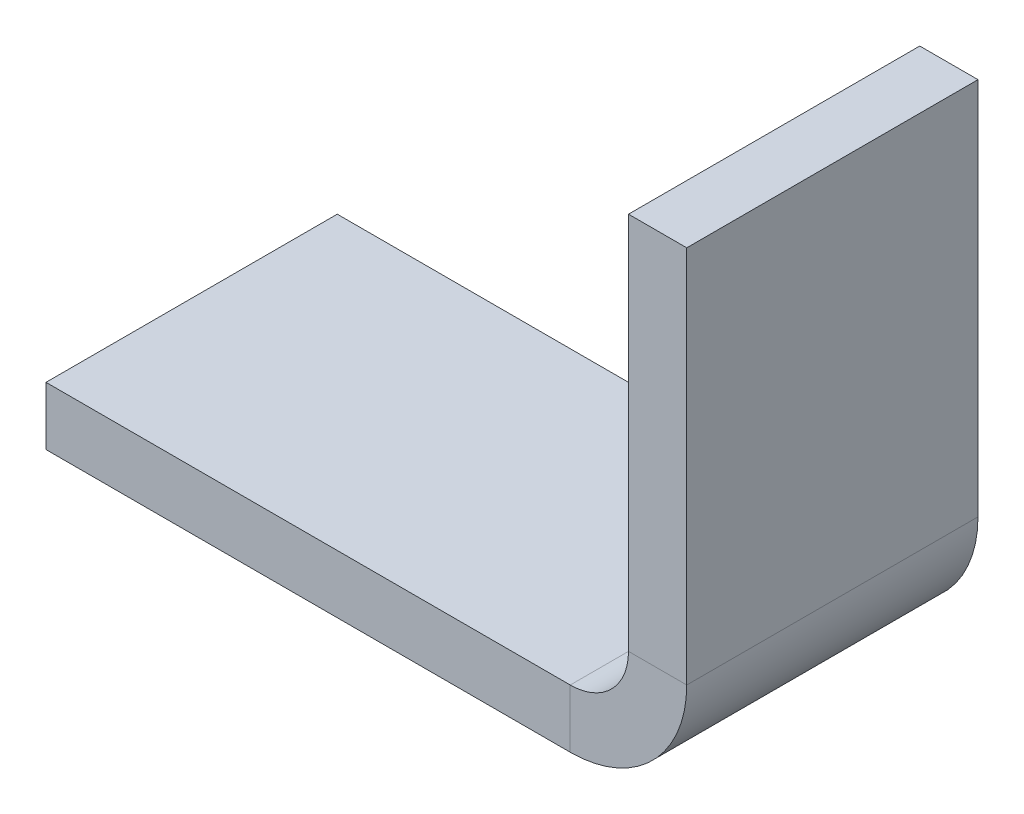
ISO-10303-21;
HEADER;
FILE_DESCRIPTION(('STEP AP214'),'2;1');
FILE_NAME('part.step','',(''),(''),'','','');
FILE_SCHEMA(('AUTOMOTIVE_DESIGN { 1 0 10303 214 1 1 1 1 }'));
ENDSEC;
DATA;
#1=APPLICATION_CONTEXT('core data for automotive mechanical design processes');
#2=APPLICATION_PROTOCOL_DEFINITION('international standard','automotive_design',2000,#1);
#3=PRODUCT_CONTEXT('',#1,'mechanical');
#4=PRODUCT('Part','Part','',(#3));
#5=PRODUCT_RELATED_PRODUCT_CATEGORY('part','',(#4));
#6=PRODUCT_DEFINITION_FORMATION('','',#4);
#7=PRODUCT_DEFINITION_CONTEXT('part definition',#1,'design');
#8=PRODUCT_DEFINITION('design','',#6,#7);
#9=PRODUCT_DEFINITION_SHAPE('','',#8);
#10=(LENGTH_UNIT() NAMED_UNIT(*) SI_UNIT(.MILLI.,.METRE.));
#11=(NAMED_UNIT(*) PLANE_ANGLE_UNIT() SI_UNIT($,.RADIAN.));
#12=(NAMED_UNIT(*) SI_UNIT($,.STERADIAN.) SOLID_ANGLE_UNIT());
#13=UNCERTAINTY_MEASURE_WITH_UNIT(LENGTH_MEASURE(1.E-05),#10,'distance_accuracy_value','');
#14=(GEOMETRIC_REPRESENTATION_CONTEXT(3) GLOBAL_UNCERTAINTY_ASSIGNED_CONTEXT((#13)) GLOBAL_UNIT_ASSIGNED_CONTEXT((#10,
#11,#12)) REPRESENTATION_CONTEXT('',''));
#15=CARTESIAN_POINT('',(0.,0.,0.));
#16=DIRECTION('',(0.,0.,1.));
#17=DIRECTION('',(1.,0.,0.));
#18=AXIS2_PLACEMENT_3D('',#15,#16,#17);
#19=CARTESIAN_POINT('',(20.,2.,10.));
#20=DIRECTION('',(0.,0.,1.));
#21=DIRECTION('',(1.,0.,0.));
#22=AXIS2_PLACEMENT_3D('',#19,#20,#21);
#23=PLANE('',#22);
#24=DIRECTION('',(1.,0.,0.));
#25=VECTOR('',#24,1.);
#26=CARTESIAN_POINT('',(20.,2.,10.));
#27=LINE('',#26,#25);
#28=CARTESIAN_POINT('',(20.,2.,10.));
#29=VERTEX_POINT('',#28);
#30=CARTESIAN_POINT('',(22.,2.,10.));
#31=VERTEX_POINT('',#30);
#32=EDGE_CURVE('E11',#29,#31,#27,.T.);
#33=ORIENTED_EDGE('',*,*,#32,.F.);
#34=CARTESIAN_POINT('',(18.,2.,10.));
#35=DIRECTION('',(0.,0.,-1.));
#36=DIRECTION('',(-1.,0.,0.));
#37=AXIS2_PLACEMENT_3D('',#34,#35,#36);
#38=CIRCLE('',#37,2.);
#39=CARTESIAN_POINT('',(18.,0.,10.));
#40=VERTEX_POINT('',#39);
#41=EDGE_CURVE('E139',#40,#29,#38,.F.);
#42=ORIENTED_EDGE('',*,*,#41,.F.);
#43=DIRECTION('',(0.,1.,0.));
#44=VECTOR('',#43,1.);
#45=CARTESIAN_POINT('',(18.,-2.,10.));
#46=LINE('',#45,#44);
#47=CARTESIAN_POINT('',(18.,-2.,10.));
#48=VERTEX_POINT('',#47);
#49=EDGE_CURVE('E47',#48,#40,#46,.T.);
#50=ORIENTED_EDGE('',*,*,#49,.F.);
#51=CARTESIAN_POINT('',(18.,2.,10.));
#52=DIRECTION('',(0.,0.,1.));
#53=DIRECTION('',(1.,0.,0.));
#54=AXIS2_PLACEMENT_3D('',#51,#52,#53);
#55=CIRCLE('',#54,4.);
#56=EDGE_CURVE('E133',#48,#31,#55,.T.);
#57=ORIENTED_EDGE('',*,*,#56,.T.);
#58=EDGE_LOOP('',(#33,#42,#50,#57));
#59=FACE_BOUND('',#58,.T.);
#60=ADVANCED_FACE('F41',(#59),#23,.T.);
#61=CARTESIAN_POINT('',(18.,-2.,10.));
#62=DIRECTION('',(0.,0.,1.));
#63=DIRECTION('',(1.,0.,0.));
#64=AXIS2_PLACEMENT_3D('',#61,#62,#63);
#65=PLANE('',#64);
#66=DIRECTION('',(0.,1.,0.));
#67=VECTOR('',#66,1.);
#68=CARTESIAN_POINT('',(20.,0.,10.));
#69=LINE('',#68,#67);
#70=CARTESIAN_POINT('',(20.,15.,10.));
#71=VERTEX_POINT('',#70);
#72=EDGE_CURVE('E189',#29,#71,#69,.T.);
#73=ORIENTED_EDGE('',*,*,#72,.F.);
#74=ORIENTED_EDGE('',*,*,#32,.T.);
#75=DIRECTION('',(0.,1.,0.));
#76=VECTOR('',#75,1.);
#77=CARTESIAN_POINT('',(22.,0.,10.));
#78=LINE('',#77,#76);
#79=CARTESIAN_POINT('',(22.,15.,10.));
#80=VERTEX_POINT('',#79);
#81=EDGE_CURVE('E100',#31,#80,#78,.T.);
#82=ORIENTED_EDGE('',*,*,#81,.T.);
#83=DIRECTION('',(1.,0.,0.));
#84=VECTOR('',#83,1.);
#85=CARTESIAN_POINT('',(20.,15.,10.));
#86=LINE('',#85,#84);
#87=EDGE_CURVE('E341',#71,#80,#86,.T.);
#88=ORIENTED_EDGE('',*,*,#87,.F.);
#89=EDGE_LOOP('',(#73,#74,#82,#88));
#90=FACE_BOUND('',#89,.T.);
#91=ADVANCED_FACE('F193',(#90),#65,.T.);
#92=CARTESIAN_POINT('',(18.,0.,0.));
#93=DIRECTION('',(0.,0.,-1.));
#94=DIRECTION('',(-1.,0.,0.));
#95=AXIS2_PLACEMENT_3D('',#92,#93,#94);
#96=PLANE('',#95);
#97=DIRECTION('',(0.,-1.,0.));
#98=VECTOR('',#97,1.);
#99=CARTESIAN_POINT('',(18.,0.,0.));
#100=LINE('',#99,#98);
#101=CARTESIAN_POINT('',(18.,0.,0.));
#102=VERTEX_POINT('',#101);
#103=CARTESIAN_POINT('',(18.,-2.,0.));
#104=VERTEX_POINT('',#103);
#105=EDGE_CURVE('E81',#102,#104,#100,.T.);
#106=ORIENTED_EDGE('',*,*,#105,.F.);
#107=CARTESIAN_POINT('',(18.,2.,0.));
#108=DIRECTION('',(0.,0.,-1.));
#109=DIRECTION('',(-1.,0.,0.));
#110=AXIS2_PLACEMENT_3D('',#107,#108,#109);
#111=CIRCLE('',#110,2.);
#112=CARTESIAN_POINT('',(20.,2.,0.));
#113=VERTEX_POINT('',#112);
#114=EDGE_CURVE('E153',#102,#113,#111,.F.);
#115=ORIENTED_EDGE('',*,*,#114,.T.);
#116=DIRECTION('',(-1.,0.,0.));
#117=VECTOR('',#116,1.);
#118=CARTESIAN_POINT('',(22.,2.,0.));
#119=LINE('',#118,#117);
#120=CARTESIAN_POINT('',(22.,2.,0.));
#121=VERTEX_POINT('',#120);
#122=EDGE_CURVE('E93',#121,#113,#119,.T.);
#123=ORIENTED_EDGE('',*,*,#122,.F.);
#124=CARTESIAN_POINT('',(18.,2.,0.));
#125=DIRECTION('',(0.,0.,1.));
#126=DIRECTION('',(1.,0.,0.));
#127=AXIS2_PLACEMENT_3D('',#124,#125,#126);
#128=CIRCLE('',#127,4.);
#129=EDGE_CURVE('E159',#104,#121,#128,.T.);
#130=ORIENTED_EDGE('',*,*,#129,.F.);
#131=EDGE_LOOP('',(#106,#115,#123,#130));
#132=FACE_BOUND('',#131,.T.);
#133=ADVANCED_FACE('F194',(#132),#96,.T.);
#134=CARTESIAN_POINT('',(22.,2.,0.));
#135=DIRECTION('',(0.,0.,-1.));
#136=DIRECTION('',(-1.,0.,0.));
#137=AXIS2_PLACEMENT_3D('',#134,#135,#136);
#138=PLANE('',#137);
#139=DIRECTION('',(1.,0.,0.));
#140=VECTOR('',#139,1.);
#141=CARTESIAN_POINT('',(0.,0.,0.));
#142=LINE('',#141,#140);
#143=CARTESIAN_POINT('',(0.,0.,0.));
#144=VERTEX_POINT('',#143);
#145=EDGE_CURVE('E154',#144,#102,#142,.T.);
#146=ORIENTED_EDGE('',*,*,#145,.T.);
#147=ORIENTED_EDGE('',*,*,#105,.T.);
#148=DIRECTION('',(1.,0.,0.));
#149=VECTOR('',#148,1.);
#150=CARTESIAN_POINT('',(0.,-2.,0.));
#151=LINE('',#150,#149);
#152=CARTESIAN_POINT('',(0.,-2.,0.));
#153=VERTEX_POINT('',#152);
#154=EDGE_CURVE('E158',#153,#104,#151,.T.);
#155=ORIENTED_EDGE('',*,*,#154,.F.);
#156=DIRECTION('',(0.,1.,0.));
#157=VECTOR('',#156,1.);
#158=CARTESIAN_POINT('',(0.,-2.,0.));
#159=LINE('',#158,#157);
#160=EDGE_CURVE('E120',#153,#144,#159,.T.);
#161=ORIENTED_EDGE('',*,*,#160,.T.);
#162=EDGE_LOOP('',(#146,#147,#155,#161));
#163=FACE_BOUND('',#162,.T.);
#164=ADVANCED_FACE('F190',(#163),#138,.T.);
#165=CARTESIAN_POINT('',(22.,0.,10.));
#166=DIRECTION('',(-1.,0.,0.));
#167=DIRECTION('',(0.,0.,1.));
#168=AXIS2_PLACEMENT_3D('',#165,#166,#167);
#169=PLANE('',#168);
#170=DIRECTION('',(0.,1.,0.));
#171=VECTOR('',#170,1.);
#172=CARTESIAN_POINT('',(22.,0.,0.));
#173=LINE('',#172,#171);
#174=CARTESIAN_POINT('',(22.,15.,0.));
#175=VERTEX_POINT('',#174);
#176=EDGE_CURVE('E145',#121,#175,#173,.T.);
#177=ORIENTED_EDGE('',*,*,#176,.T.);
#178=DIRECTION('',(0.,0.,-1.));
#179=VECTOR('',#178,1.);
#180=CARTESIAN_POINT('',(22.,15.,10.));
#181=LINE('',#180,#179);
#182=EDGE_CURVE('E175',#80,#175,#181,.T.);
#183=ORIENTED_EDGE('',*,*,#182,.F.);
#184=ORIENTED_EDGE('',*,*,#81,.F.);
#185=DIRECTION('',(0.,0.,-1.));
#186=VECTOR('',#185,1.);
#187=CARTESIAN_POINT('',(22.,2.,10.));
#188=LINE('',#187,#186);
#189=EDGE_CURVE('E141',#31,#121,#188,.T.);
#190=ORIENTED_EDGE('',*,*,#189,.T.);
#191=EDGE_LOOP('',(#177,#183,#184,#190));
#192=FACE_BOUND('',#191,.T.);
#193=ADVANCED_FACE('F203',(#192),#169,.F.);
#194=CARTESIAN_POINT('',(20.,15.,10.));
#195=DIRECTION('',(0.,1.,0.));
#196=DIRECTION('',(0.,0.,1.));
#197=AXIS2_PLACEMENT_3D('',#194,#195,#196);
#198=PLANE('',#197);
#199=DIRECTION('',(1.,0.,0.));
#200=VECTOR('',#199,1.);
#201=CARTESIAN_POINT('',(20.,15.,0.));
#202=LINE('',#201,#200);
#203=CARTESIAN_POINT('',(20.,15.,0.));
#204=VERTEX_POINT('',#203);
#205=EDGE_CURVE('E150',#204,#175,#202,.T.);
#206=ORIENTED_EDGE('',*,*,#205,.F.);
#207=DIRECTION('',(0.,0.,-1.));
#208=VECTOR('',#207,1.);
#209=CARTESIAN_POINT('',(20.,15.,10.));
#210=LINE('',#209,#208);
#211=EDGE_CURVE('E174',#71,#204,#210,.T.);
#212=ORIENTED_EDGE('',*,*,#211,.F.);
#213=ORIENTED_EDGE('',*,*,#87,.T.);
#214=ORIENTED_EDGE('',*,*,#182,.T.);
#215=EDGE_LOOP('',(#206,#212,#213,#214));
#216=FACE_BOUND('',#215,.T.);
#217=ADVANCED_FACE('F231',(#216),#198,.T.);
#218=CARTESIAN_POINT('',(20.,0.,10.));
#219=DIRECTION('',(-1.,0.,0.));
#220=DIRECTION('',(0.,0.,1.));
#221=AXIS2_PLACEMENT_3D('',#218,#219,#220);
#222=PLANE('',#221);
#223=DIRECTION('',(0.,1.,0.));
#224=VECTOR('',#223,1.);
#225=CARTESIAN_POINT('',(20.,0.,0.));
#226=LINE('',#225,#224);
#227=EDGE_CURVE('E147',#113,#204,#226,.T.);
#228=ORIENTED_EDGE('',*,*,#227,.F.);
#229=DIRECTION('',(0.,0.,-1.));
#230=VECTOR('',#229,1.);
#231=CARTESIAN_POINT('',(20.,2.,10.));
#232=LINE('',#231,#230);
#233=EDGE_CURVE('E166',#29,#113,#232,.T.);
#234=ORIENTED_EDGE('',*,*,#233,.F.);
#235=ORIENTED_EDGE('',*,*,#72,.T.);
#236=ORIENTED_EDGE('',*,*,#211,.T.);
#237=EDGE_LOOP('',(#228,#234,#235,#236));
#238=FACE_BOUND('',#237,.T.);
#239=ADVANCED_FACE('F241',(#238),#222,.T.);
#240=CARTESIAN_POINT('',(18.,2.,10.));
#241=DIRECTION('',(0.,0.,-1.));
#242=DIRECTION('',(-1.,0.,0.));
#243=AXIS2_PLACEMENT_3D('',#240,#241,#242);
#244=CYLINDRICAL_SURFACE('',#243,2.);
#245=ORIENTED_EDGE('',*,*,#114,.F.);
#246=DIRECTION('',(0.,0.,-1.));
#247=VECTOR('',#246,1.);
#248=CARTESIAN_POINT('',(18.,0.,10.));
#249=LINE('',#248,#247);
#250=EDGE_CURVE('E167',#40,#102,#249,.T.);
#251=ORIENTED_EDGE('',*,*,#250,.F.);
#252=ORIENTED_EDGE('',*,*,#41,.T.);
#253=ORIENTED_EDGE('',*,*,#233,.T.);
#254=EDGE_LOOP('',(#245,#251,#252,#253));
#255=FACE_BOUND('',#254,.T.);
#256=ADVANCED_FACE('F181',(#255),#244,.F.);
#257=CARTESIAN_POINT('',(0.,0.,10.));
#258=DIRECTION('',(0.,1.,0.));
#259=DIRECTION('',(0.,0.,1.));
#260=AXIS2_PLACEMENT_3D('',#257,#258,#259);
#261=PLANE('',#260);
#262=ORIENTED_EDGE('',*,*,#145,.F.);
#263=DIRECTION('',(0.,0.,-1.));
#264=VECTOR('',#263,1.);
#265=CARTESIAN_POINT('',(0.,0.,10.));
#266=LINE('',#265,#264);
#267=CARTESIAN_POINT('',(0.,0.,10.));
#268=VERTEX_POINT('',#267);
#269=EDGE_CURVE('E122',#268,#144,#266,.T.);
#270=ORIENTED_EDGE('',*,*,#269,.F.);
#271=DIRECTION('',(1.,0.,0.));
#272=VECTOR('',#271,1.);
#273=CARTESIAN_POINT('',(0.,0.,10.));
#274=LINE('',#273,#272);
#275=EDGE_CURVE('E137',#268,#40,#274,.T.);
#276=ORIENTED_EDGE('',*,*,#275,.T.);
#277=ORIENTED_EDGE('',*,*,#250,.T.);
#278=EDGE_LOOP('',(#262,#270,#276,#277));
#279=FACE_BOUND('',#278,.T.);
#280=ADVANCED_FACE('F187',(#279),#261,.T.);
#281=CARTESIAN_POINT('',(0.,-2.,10.));
#282=DIRECTION('',(-1.,0.,0.));
#283=DIRECTION('',(0.,0.,1.));
#284=AXIS2_PLACEMENT_3D('',#281,#282,#283);
#285=PLANE('',#284);
#286=ORIENTED_EDGE('',*,*,#160,.F.);
#287=DIRECTION('',(0.,0.,-1.));
#288=VECTOR('',#287,1.);
#289=CARTESIAN_POINT('',(0.,-2.,10.));
#290=LINE('',#289,#288);
#291=CARTESIAN_POINT('',(0.,-2.,10.));
#292=VERTEX_POINT('',#291);
#293=EDGE_CURVE('E114',#292,#153,#290,.T.);
#294=ORIENTED_EDGE('',*,*,#293,.F.);
#295=DIRECTION('',(0.,1.,0.));
#296=VECTOR('',#295,1.);
#297=CARTESIAN_POINT('',(0.,-2.,10.));
#298=LINE('',#297,#296);
#299=EDGE_CURVE('E119',#292,#268,#298,.T.);
#300=ORIENTED_EDGE('',*,*,#299,.T.);
#301=ORIENTED_EDGE('',*,*,#269,.T.);
#302=EDGE_LOOP('',(#286,#294,#300,#301));
#303=FACE_BOUND('',#302,.T.);
#304=ADVANCED_FACE('F113',(#303),#285,.T.);
#305=CARTESIAN_POINT('',(0.,-2.,10.));
#306=DIRECTION('',(0.,1.,0.));
#307=DIRECTION('',(0.,0.,1.));
#308=AXIS2_PLACEMENT_3D('',#305,#306,#307);
#309=PLANE('',#308);
#310=ORIENTED_EDGE('',*,*,#154,.T.);
#311=DIRECTION('',(0.,0.,-1.));
#312=VECTOR('',#311,1.);
#313=CARTESIAN_POINT('',(18.,-2.,10.));
#314=LINE('',#313,#312);
#315=EDGE_CURVE('E125',#48,#104,#314,.T.);
#316=ORIENTED_EDGE('',*,*,#315,.F.);
#317=DIRECTION('',(1.,0.,0.));
#318=VECTOR('',#317,1.);
#319=CARTESIAN_POINT('',(0.,-2.,10.));
#320=LINE('',#319,#318);
#321=EDGE_CURVE('E127',#292,#48,#320,.T.);
#322=ORIENTED_EDGE('',*,*,#321,.F.);
#323=ORIENTED_EDGE('',*,*,#293,.T.);
#324=EDGE_LOOP('',(#310,#316,#322,#323));
#325=FACE_BOUND('',#324,.T.);
#326=ADVANCED_FACE('F130',(#325),#309,.F.);
#327=CARTESIAN_POINT('',(18.,2.,10.));
#328=DIRECTION('',(0.,0.,-1.));
#329=DIRECTION('',(-1.,0.,0.));
#330=AXIS2_PLACEMENT_3D('',#327,#328,#329);
#331=CYLINDRICAL_SURFACE('',#330,4.);
#332=ORIENTED_EDGE('',*,*,#129,.T.);
#333=ORIENTED_EDGE('',*,*,#189,.F.);
#334=ORIENTED_EDGE('',*,*,#56,.F.);
#335=ORIENTED_EDGE('',*,*,#315,.T.);
#336=EDGE_LOOP('',(#332,#333,#334,#335));
#337=FACE_BOUND('',#336,.T.);
#338=ADVANCED_FACE('F192',(#337),#331,.T.);
#339=CARTESIAN_POINT('',(18.,2.,10.));
#340=DIRECTION('',(0.,0.,-1.));
#341=DIRECTION('',(-1.,0.,0.));
#342=AXIS2_PLACEMENT_3D('',#339,#340,#341);
#343=PLANE('',#342);
#344=ORIENTED_EDGE('',*,*,#321,.T.);
#345=ORIENTED_EDGE('',*,*,#49,.T.);
#346=ORIENTED_EDGE('',*,*,#275,.F.);
#347=ORIENTED_EDGE('',*,*,#299,.F.);
#348=EDGE_LOOP('',(#344,#345,#346,#347));
#349=FACE_BOUND('',#348,.T.);
#350=ADVANCED_FACE('F135',(#349),#343,.F.);
#351=CARTESIAN_POINT('',(18.,2.,0.));
#352=DIRECTION('',(0.,0.,-1.));
#353=DIRECTION('',(-1.,0.,0.));
#354=AXIS2_PLACEMENT_3D('',#351,#352,#353);
#355=PLANE('',#354);
#356=ORIENTED_EDGE('',*,*,#176,.F.);
#357=ORIENTED_EDGE('',*,*,#122,.T.);
#358=ORIENTED_EDGE('',*,*,#227,.T.);
#359=ORIENTED_EDGE('',*,*,#205,.T.);
#360=EDGE_LOOP('',(#356,#357,#358,#359));
#361=FACE_BOUND('',#360,.T.);
#362=ADVANCED_FACE('F313',(#361),#355,.T.);
#363=CLOSED_SHELL('',(#60,#91,#133,#164,#193,#217,#239,#256,#280,#304,#326,#338,#350,#362));
#364=MANIFOLD_SOLID_BREP('B2',#363);
#365=ADVANCED_BREP_SHAPE_REPRESENTATION('',(#18,#364),#14);
#366=SHAPE_DEFINITION_REPRESENTATION(#9,#365);
ENDSEC;
END-ISO-10303-21;
